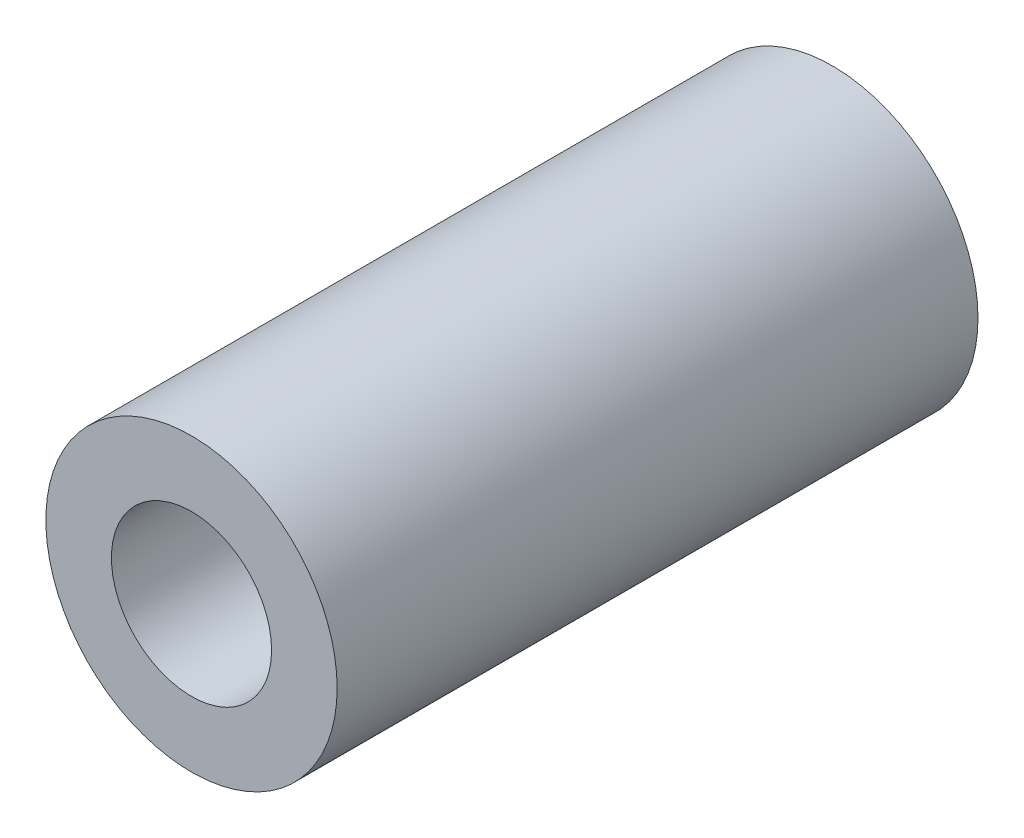
ISO-10303-21;
HEADER;
FILE_DESCRIPTION(('STEP AP214'),'2;1');
FILE_NAME('part.step','',(''),(''),'','','');
FILE_SCHEMA(('AUTOMOTIVE_DESIGN { 1 0 10303 214 1 1 1 1 }'));
ENDSEC;
DATA;
#1=APPLICATION_CONTEXT('core data for automotive mechanical design processes');
#2=APPLICATION_PROTOCOL_DEFINITION('international standard','automotive_design',2000,#1);
#3=PRODUCT_CONTEXT('',#1,'mechanical');
#4=PRODUCT('Part','Part','',(#3));
#5=PRODUCT_RELATED_PRODUCT_CATEGORY('part','',(#4));
#6=PRODUCT_DEFINITION_FORMATION('','',#4);
#7=PRODUCT_DEFINITION_CONTEXT('part definition',#1,'design');
#8=PRODUCT_DEFINITION('design','',#6,#7);
#9=PRODUCT_DEFINITION_SHAPE('','',#8);
#10=(LENGTH_UNIT() NAMED_UNIT(*) SI_UNIT(.MILLI.,.METRE.));
#11=(NAMED_UNIT(*) PLANE_ANGLE_UNIT() SI_UNIT($,.RADIAN.));
#12=(NAMED_UNIT(*) SI_UNIT($,.STERADIAN.) SOLID_ANGLE_UNIT());
#13=UNCERTAINTY_MEASURE_WITH_UNIT(LENGTH_MEASURE(1.E-05),#10,'distance_accuracy_value','');
#14=(GEOMETRIC_REPRESENTATION_CONTEXT(3) GLOBAL_UNCERTAINTY_ASSIGNED_CONTEXT((#13)) GLOBAL_UNIT_ASSIGNED_CONTEXT((#10,
#11,#12)) REPRESENTATION_CONTEXT('',''));
#15=CARTESIAN_POINT('',(0.,0.,0.));
#16=DIRECTION('',(0.,0.,1.));
#17=DIRECTION('',(1.,0.,0.));
#18=AXIS2_PLACEMENT_3D('',#15,#16,#17);
#19=CARTESIAN_POINT('',(0.,0.,22.));
#20=DIRECTION('',(0.,0.,1.));
#21=DIRECTION('',(1.,0.,0.));
#22=AXIS2_PLACEMENT_3D('',#19,#20,#21);
#23=PLANE('',#22);
#24=CARTESIAN_POINT('',(0.,0.,22.));
#25=DIRECTION('',(0.,0.,1.));
#26=DIRECTION('',(1.,0.,0.));
#27=AXIS2_PLACEMENT_3D('',#24,#25,#26);
#28=CIRCLE('',#27,5.);
#29=CARTESIAN_POINT('',(5.,0.,22.));
#30=VERTEX_POINT('',#29);
#31=EDGE_CURVE('E10',#30,#30,#28,.T.);
#32=ORIENTED_EDGE('',*,*,#31,.T.);
#33=EDGE_LOOP('',(#32));
#34=FACE_BOUND('',#33,.T.);
#35=CARTESIAN_POINT('',(0.,0.,22.));
#36=DIRECTION('',(0.,0.,1.));
#37=DIRECTION('',(1.,0.,0.));
#38=AXIS2_PLACEMENT_3D('',#35,#36,#37);
#39=CIRCLE('',#38,2.75);
#40=CARTESIAN_POINT('',(2.75,0.,22.));
#41=VERTEX_POINT('',#40);
#42=EDGE_CURVE('E54',#41,#41,#39,.T.);
#43=ORIENTED_EDGE('',*,*,#42,.F.);
#44=EDGE_LOOP('',(#43));
#45=FACE_BOUND('',#44,.T.);
#46=ADVANCED_FACE('F38',(#34,#45),#23,.T.);
#47=CARTESIAN_POINT('',(0.,0.,0.));
#48=DIRECTION('',(0.,0.,1.));
#49=DIRECTION('',(1.,0.,0.));
#50=AXIS2_PLACEMENT_3D('',#47,#48,#49);
#51=PLANE('',#50);
#52=CARTESIAN_POINT('',(0.,0.,0.));
#53=DIRECTION('',(0.,0.,1.));
#54=DIRECTION('',(1.,0.,0.));
#55=AXIS2_PLACEMENT_3D('',#52,#53,#54);
#56=CIRCLE('',#55,5.);
#57=CARTESIAN_POINT('',(5.,0.,0.));
#58=VERTEX_POINT('',#57);
#59=EDGE_CURVE('E42',#58,#58,#56,.T.);
#60=ORIENTED_EDGE('',*,*,#59,.F.);
#61=EDGE_LOOP('',(#60));
#62=FACE_BOUND('',#61,.T.);
#63=CARTESIAN_POINT('',(0.,0.,0.));
#64=DIRECTION('',(0.,0.,1.));
#65=DIRECTION('',(1.,0.,0.));
#66=AXIS2_PLACEMENT_3D('',#63,#64,#65);
#67=CIRCLE('',#66,2.75);
#68=CARTESIAN_POINT('',(2.75,0.,0.));
#69=VERTEX_POINT('',#68);
#70=EDGE_CURVE('E56',#69,#69,#67,.T.);
#71=ORIENTED_EDGE('',*,*,#70,.T.);
#72=EDGE_LOOP('',(#71));
#73=FACE_BOUND('',#72,.T.);
#74=ADVANCED_FACE('F67',(#62,#73),#51,.F.);
#75=CARTESIAN_POINT('',(0.,0.,22.));
#76=DIRECTION('',(0.,0.,-1.));
#77=DIRECTION('',(-1.,0.,0.));
#78=AXIS2_PLACEMENT_3D('',#75,#76,#77);
#79=CYLINDRICAL_SURFACE('',#78,5.);
#80=ORIENTED_EDGE('',*,*,#31,.F.);
#81=EDGE_LOOP('',(#80));
#82=FACE_BOUND('',#81,.T.);
#83=ORIENTED_EDGE('',*,*,#59,.T.);
#84=EDGE_LOOP('',(#83));
#85=FACE_BOUND('',#84,.T.);
#86=ADVANCED_FACE('F40',(#82,#85),#79,.T.);
#87=CARTESIAN_POINT('',(0.,0.,22.));
#88=DIRECTION('',(0.,0.,-1.));
#89=DIRECTION('',(-1.,0.,0.));
#90=AXIS2_PLACEMENT_3D('',#87,#88,#89);
#91=CYLINDRICAL_SURFACE('',#90,2.75);
#92=ORIENTED_EDGE('',*,*,#42,.T.);
#93=EDGE_LOOP('',(#92));
#94=FACE_BOUND('',#93,.T.);
#95=ORIENTED_EDGE('',*,*,#70,.F.);
#96=EDGE_LOOP('',(#95));
#97=FACE_BOUND('',#96,.T.);
#98=ADVANCED_FACE('F63',(#94,#97),#91,.F.);
#99=CLOSED_SHELL('',(#46,#74,#86,#98));
#100=MANIFOLD_SOLID_BREP('B2',#99);
#101=ADVANCED_BREP_SHAPE_REPRESENTATION('',(#18,#100),#14);
#102=SHAPE_DEFINITION_REPRESENTATION(#9,#101);
ENDSEC;
END-ISO-10303-21;
